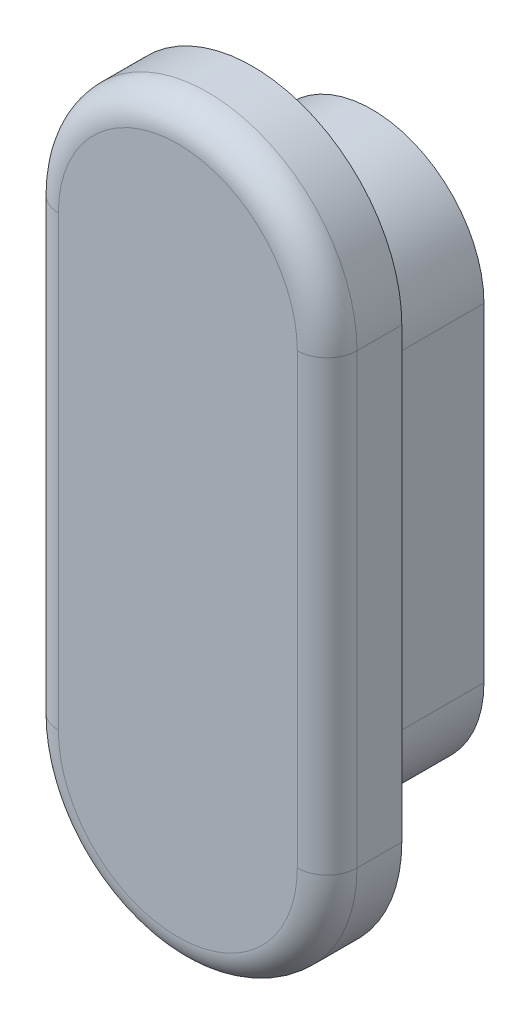
ISO-10303-21;
HEADER;
FILE_DESCRIPTION(('STEP AP214'),'2;1');
FILE_NAME('part.step','',(''),(''),'','','');
FILE_SCHEMA(('AUTOMOTIVE_DESIGN { 1 0 10303 214 1 1 1 1 }'));
ENDSEC;
DATA;
#1=APPLICATION_CONTEXT('core data for automotive mechanical design processes');
#2=APPLICATION_PROTOCOL_DEFINITION('international standard','automotive_design',2000,#1);
#3=PRODUCT_CONTEXT('',#1,'mechanical');
#4=PRODUCT('Part','Part','',(#3));
#5=PRODUCT_RELATED_PRODUCT_CATEGORY('part','',(#4));
#6=PRODUCT_DEFINITION_FORMATION('','',#4);
#7=PRODUCT_DEFINITION_CONTEXT('part definition',#1,'design');
#8=PRODUCT_DEFINITION('design','',#6,#7);
#9=PRODUCT_DEFINITION_SHAPE('','',#8);
#10=(LENGTH_UNIT() NAMED_UNIT(*) SI_UNIT(.MILLI.,.METRE.));
#11=(NAMED_UNIT(*) PLANE_ANGLE_UNIT() SI_UNIT($,.RADIAN.));
#12=(NAMED_UNIT(*) SI_UNIT($,.STERADIAN.) SOLID_ANGLE_UNIT());
#13=UNCERTAINTY_MEASURE_WITH_UNIT(LENGTH_MEASURE(1.E-05),#10,'distance_accuracy_value','');
#14=(GEOMETRIC_REPRESENTATION_CONTEXT(3) GLOBAL_UNCERTAINTY_ASSIGNED_CONTEXT((#13)) GLOBAL_UNIT_ASSIGNED_CONTEXT((#10,
#11,#12)) REPRESENTATION_CONTEXT('',''));
#15=CARTESIAN_POINT('',(0.,0.,0.));
#16=DIRECTION('',(0.,0.,1.));
#17=DIRECTION('',(1.,0.,0.));
#18=AXIS2_PLACEMENT_3D('',#15,#16,#17);
#19=CARTESIAN_POINT('',(0.,-11.,0.));
#20=DIRECTION('',(0.,0.,1.));
#21=DIRECTION('',(1.,0.,0.));
#22=AXIS2_PLACEMENT_3D('',#19,#20,#21);
#23=PLANE('',#22);
#24=CARTESIAN_POINT('',(0.,-11.,0.));
#25=DIRECTION('',(0.,0.,1.));
#26=DIRECTION('',(1.,0.,0.));
#27=AXIS2_PLACEMENT_3D('',#24,#25,#26);
#28=CIRCLE('',#27,7.5);
#29=CARTESIAN_POINT('',(-7.5,-11.,0.));
#30=VERTEX_POINT('',#29);
#31=CARTESIAN_POINT('',(7.5,-11.,0.));
#32=VERTEX_POINT('',#31);
#33=EDGE_CURVE('E164',#30,#32,#28,.T.);
#34=ORIENTED_EDGE('',*,*,#33,.F.);
#35=DIRECTION('',(0.,-1.,0.));
#36=VECTOR('',#35,1.);
#37=CARTESIAN_POINT('',(-7.5,-11.,0.));
#38=LINE('',#37,#36);
#39=CARTESIAN_POINT('',(-7.5,11.,0.));
#40=VERTEX_POINT('',#39);
#41=EDGE_CURVE('E169',#40,#30,#38,.T.);
#42=ORIENTED_EDGE('',*,*,#41,.F.);
#43=CARTESIAN_POINT('',(0.,11.,0.));
#44=DIRECTION('',(0.,0.,1.));
#45=DIRECTION('',(1.,0.,0.));
#46=AXIS2_PLACEMENT_3D('',#43,#44,#45);
#47=CIRCLE('',#46,7.5);
#48=CARTESIAN_POINT('',(7.5,11.,0.));
#49=VERTEX_POINT('',#48);
#50=EDGE_CURVE('E183',#49,#40,#47,.T.);
#51=ORIENTED_EDGE('',*,*,#50,.F.);
#52=DIRECTION('',(0.,1.,0.));
#53=VECTOR('',#52,1.);
#54=CARTESIAN_POINT('',(7.5,-11.,0.));
#55=LINE('',#54,#53);
#56=EDGE_CURVE('E181',#32,#49,#55,.T.);
#57=ORIENTED_EDGE('',*,*,#56,.F.);
#58=EDGE_LOOP('',(#34,#42,#51,#57));
#59=FACE_BOUND('',#58,.T.);
#60=CARTESIAN_POINT('',(0.,-11.,0.));
#61=DIRECTION('',(0.,0.,1.));
#62=DIRECTION('',(1.,0.,0.));
#63=AXIS2_PLACEMENT_3D('',#60,#61,#62);
#64=CIRCLE('',#63,2.);
#65=CARTESIAN_POINT('',(2.,-11.,0.));
#66=VERTEX_POINT('',#65);
#67=EDGE_CURVE('E159',#66,#66,#64,.T.);
#68=ORIENTED_EDGE('',*,*,#67,.T.);
#69=EDGE_LOOP('',(#68));
#70=FACE_BOUND('',#69,.T.);
#71=CARTESIAN_POINT('',(0.,11.,0.));
#72=DIRECTION('',(0.,0.,1.));
#73=DIRECTION('',(1.,0.,0.));
#74=AXIS2_PLACEMENT_3D('',#71,#72,#73);
#75=CIRCLE('',#74,2.);
#76=CARTESIAN_POINT('',(2.,11.,0.));
#77=VERTEX_POINT('',#76);
#78=EDGE_CURVE('E156',#77,#77,#75,.T.);
#79=ORIENTED_EDGE('',*,*,#78,.T.);
#80=EDGE_LOOP('',(#79));
#81=FACE_BOUND('',#80,.T.);
#82=ADVANCED_FACE('F41',(#59,#70,#81),#23,.F.);
#83=CARTESIAN_POINT('',(0.,-11.,8.));
#84=DIRECTION('',(0.,0.,-1.));
#85=DIRECTION('',(-1.,0.,0.));
#86=AXIS2_PLACEMENT_3D('',#83,#84,#85);
#87=CYLINDRICAL_SURFACE('',#86,7.5);
#88=ORIENTED_EDGE('',*,*,#33,.T.);
#89=DIRECTION('',(0.,0.,-1.));
#90=VECTOR('',#89,1.);
#91=CARTESIAN_POINT('',(7.5,-11.,8.));
#92=LINE('',#91,#90);
#93=CARTESIAN_POINT('',(7.5,-11.,8.));
#94=VERTEX_POINT('',#93);
#95=EDGE_CURVE('E194',#94,#32,#92,.T.);
#96=ORIENTED_EDGE('',*,*,#95,.F.);
#97=CARTESIAN_POINT('',(0.,-11.,8.));
#98=DIRECTION('',(0.,0.,1.));
#99=DIRECTION('',(1.,0.,0.));
#100=AXIS2_PLACEMENT_3D('',#97,#98,#99);
#101=CIRCLE('',#100,7.5);
#102=CARTESIAN_POINT('',(-7.5,-11.,8.));
#103=VERTEX_POINT('',#102);
#104=EDGE_CURVE('E165',#103,#94,#101,.T.);
#105=ORIENTED_EDGE('',*,*,#104,.F.);
#106=DIRECTION('',(0.,0.,-1.));
#107=VECTOR('',#106,1.);
#108=CARTESIAN_POINT('',(-7.5,-11.,8.));
#109=LINE('',#108,#107);
#110=EDGE_CURVE('E178',#103,#30,#109,.T.);
#111=ORIENTED_EDGE('',*,*,#110,.T.);
#112=EDGE_LOOP('',(#88,#96,#105,#111));
#113=FACE_BOUND('',#112,.T.);
#114=ADVANCED_FACE('F239',(#113),#87,.T.);
#115=CARTESIAN_POINT('',(7.5,-11.,8.));
#116=DIRECTION('',(-1.,0.,0.));
#117=DIRECTION('',(0.,-1.,0.));
#118=AXIS2_PLACEMENT_3D('',#115,#116,#117);
#119=PLANE('',#118);
#120=ORIENTED_EDGE('',*,*,#56,.T.);
#121=DIRECTION('',(0.,0.,-1.));
#122=VECTOR('',#121,1.);
#123=CARTESIAN_POINT('',(7.5,11.,8.));
#124=LINE('',#123,#122);
#125=CARTESIAN_POINT('',(7.5,11.,8.));
#126=VERTEX_POINT('',#125);
#127=EDGE_CURVE('E191',#126,#49,#124,.T.);
#128=ORIENTED_EDGE('',*,*,#127,.F.);
#129=DIRECTION('',(0.,1.,0.));
#130=VECTOR('',#129,1.);
#131=CARTESIAN_POINT('',(7.5,-11.,8.));
#132=LINE('',#131,#130);
#133=EDGE_CURVE('E168',#94,#126,#132,.T.);
#134=ORIENTED_EDGE('',*,*,#133,.F.);
#135=ORIENTED_EDGE('',*,*,#95,.T.);
#136=EDGE_LOOP('',(#120,#128,#134,#135));
#137=FACE_BOUND('',#136,.T.);
#138=ADVANCED_FACE('F246',(#137),#119,.F.);
#139=CARTESIAN_POINT('',(0.,11.,8.));
#140=DIRECTION('',(0.,0.,-1.));
#141=DIRECTION('',(-1.,0.,0.));
#142=AXIS2_PLACEMENT_3D('',#139,#140,#141);
#143=CYLINDRICAL_SURFACE('',#142,7.5);
#144=ORIENTED_EDGE('',*,*,#50,.T.);
#145=DIRECTION('',(0.,0.,-1.));
#146=VECTOR('',#145,1.);
#147=CARTESIAN_POINT('',(-7.5,11.,8.));
#148=LINE('',#147,#146);
#149=CARTESIAN_POINT('',(-7.5,11.,8.));
#150=VERTEX_POINT('',#149);
#151=EDGE_CURVE('E188',#150,#40,#148,.T.);
#152=ORIENTED_EDGE('',*,*,#151,.F.);
#153=CARTESIAN_POINT('',(0.,11.,8.));
#154=DIRECTION('',(0.,0.,1.));
#155=DIRECTION('',(1.,0.,0.));
#156=AXIS2_PLACEMENT_3D('',#153,#154,#155);
#157=CIRCLE('',#156,7.5);
#158=EDGE_CURVE('E172',#126,#150,#157,.T.);
#159=ORIENTED_EDGE('',*,*,#158,.F.);
#160=ORIENTED_EDGE('',*,*,#127,.T.);
#161=EDGE_LOOP('',(#144,#152,#159,#160));
#162=FACE_BOUND('',#161,.T.);
#163=ADVANCED_FACE('F258',(#162),#143,.T.);
#164=CARTESIAN_POINT('',(-7.5,-11.,8.));
#165=DIRECTION('',(1.,0.,0.));
#166=DIRECTION('',(0.,1.,0.));
#167=AXIS2_PLACEMENT_3D('',#164,#165,#166);
#168=PLANE('',#167);
#169=ORIENTED_EDGE('',*,*,#41,.T.);
#170=ORIENTED_EDGE('',*,*,#110,.F.);
#171=DIRECTION('',(0.,-1.,0.));
#172=VECTOR('',#171,1.);
#173=CARTESIAN_POINT('',(-7.5,-11.,8.));
#174=LINE('',#173,#172);
#175=EDGE_CURVE('E175',#150,#103,#174,.T.);
#176=ORIENTED_EDGE('',*,*,#175,.F.);
#177=ORIENTED_EDGE('',*,*,#151,.T.);
#178=EDGE_LOOP('',(#169,#170,#176,#177));
#179=FACE_BOUND('',#178,.T.);
#180=ADVANCED_FACE('F255',(#179),#168,.F.);
#181=CARTESIAN_POINT('',(0.,-11.,8.));
#182=DIRECTION('',(0.,0.,-1.));
#183=DIRECTION('',(-1.,0.,0.));
#184=AXIS2_PLACEMENT_3D('',#181,#182,#183);
#185=CYLINDRICAL_SURFACE('',#184,2.);
#186=CARTESIAN_POINT('',(0.,-11.,8.));
#187=DIRECTION('',(0.,0.,1.));
#188=DIRECTION('',(1.,0.,0.));
#189=AXIS2_PLACEMENT_3D('',#186,#187,#188);
#190=CIRCLE('',#189,2.);
#191=CARTESIAN_POINT('',(2.,-11.,8.));
#192=VERTEX_POINT('',#191);
#193=EDGE_CURVE('E155',#192,#192,#190,.T.);
#194=ORIENTED_EDGE('',*,*,#193,.T.);
#195=EDGE_LOOP('',(#194));
#196=FACE_BOUND('',#195,.T.);
#197=ORIENTED_EDGE('',*,*,#67,.F.);
#198=EDGE_LOOP('',(#197));
#199=FACE_BOUND('',#198,.T.);
#200=ADVANCED_FACE('F253',(#196,#199),#185,.F.);
#201=CARTESIAN_POINT('',(0.,11.,8.));
#202=DIRECTION('',(0.,0.,-1.));
#203=DIRECTION('',(-1.,0.,0.));
#204=AXIS2_PLACEMENT_3D('',#201,#202,#203);
#205=CYLINDRICAL_SURFACE('',#204,2.);
#206=CARTESIAN_POINT('',(0.,11.,8.));
#207=DIRECTION('',(0.,0.,1.));
#208=DIRECTION('',(1.,0.,0.));
#209=AXIS2_PLACEMENT_3D('',#206,#207,#208);
#210=CIRCLE('',#209,2.);
#211=CARTESIAN_POINT('',(2.,11.,8.));
#212=VERTEX_POINT('',#211);
#213=EDGE_CURVE('E128',#212,#212,#210,.T.);
#214=ORIENTED_EDGE('',*,*,#213,.T.);
#215=EDGE_LOOP('',(#214));
#216=FACE_BOUND('',#215,.T.);
#217=ORIENTED_EDGE('',*,*,#78,.F.);
#218=EDGE_LOOP('',(#217));
#219=FACE_BOUND('',#218,.T.);
#220=ADVANCED_FACE('F355',(#216,#219),#205,.F.);
#221=CARTESIAN_POINT('',(0.,-15.,8.));
#222=DIRECTION('',(0.,0.,1.));
#223=DIRECTION('',(1.,0.,0.));
#224=AXIS2_PLACEMENT_3D('',#221,#222,#223);
#225=PLANE('',#224);
#226=ORIENTED_EDGE('',*,*,#213,.F.);
#227=EDGE_LOOP('',(#226));
#228=FACE_BOUND('',#227,.T.);
#229=ADVANCED_FACE('F297',(#228),#225,.F.);
#230=ORIENTED_EDGE('',*,*,#175,.T.);
#231=ORIENTED_EDGE('',*,*,#104,.T.);
#232=ORIENTED_EDGE('',*,*,#133,.T.);
#233=ORIENTED_EDGE('',*,*,#158,.T.);
#234=EDGE_LOOP('',(#230,#231,#232,#233));
#235=FACE_BOUND('',#234,.T.);
#236=CARTESIAN_POINT('',(0.,-15.,8.));
#237=DIRECTION('',(0.,0.,1.));
#238=DIRECTION('',(1.,0.,0.));
#239=AXIS2_PLACEMENT_3D('',#236,#237,#238);
#240=CIRCLE('',#239,10.);
#241=CARTESIAN_POINT('',(-10.,-15.,8.));
#242=VERTEX_POINT('',#241);
#243=CARTESIAN_POINT('',(10.,-15.,8.));
#244=VERTEX_POINT('',#243);
#245=EDGE_CURVE('E135',#242,#244,#240,.T.);
#246=ORIENTED_EDGE('',*,*,#245,.F.);
#247=DIRECTION('',(0.,-1.,0.));
#248=VECTOR('',#247,1.);
#249=CARTESIAN_POINT('',(-10.,-15.,8.));
#250=LINE('',#249,#248);
#251=CARTESIAN_POINT('',(-10.,15.,8.));
#252=VERTEX_POINT('',#251);
#253=EDGE_CURVE('E147',#252,#242,#250,.T.);
#254=ORIENTED_EDGE('',*,*,#253,.F.);
#255=CARTESIAN_POINT('',(0.,15.,8.));
#256=DIRECTION('',(0.,0.,1.));
#257=DIRECTION('',(1.,0.,0.));
#258=AXIS2_PLACEMENT_3D('',#255,#256,#257);
#259=CIRCLE('',#258,10.);
#260=CARTESIAN_POINT('',(9.99999999999999,15.,8.));
#261=VERTEX_POINT('',#260);
#262=EDGE_CURVE('E137',#261,#252,#259,.T.);
#263=ORIENTED_EDGE('',*,*,#262,.F.);
#264=DIRECTION('',(0.,1.,0.));
#265=VECTOR('',#264,1.);
#266=CARTESIAN_POINT('',(10.,-15.,8.));
#267=LINE('',#266,#265);
#268=EDGE_CURVE('E123',#244,#261,#267,.T.);
#269=ORIENTED_EDGE('',*,*,#268,.F.);
#270=EDGE_LOOP('',(#246,#254,#263,#269));
#271=FACE_BOUND('',#270,.T.);
#272=ADVANCED_FACE('F133',(#235,#271),#225,.F.);
#273=CARTESIAN_POINT('',(0.,-15.,13.));
#274=DIRECTION('',(0.,0.,1.));
#275=DIRECTION('',(1.,0.,0.));
#276=AXIS2_PLACEMENT_3D('',#273,#274,#275);
#277=PLANE('',#276);
#278=CARTESIAN_POINT('',(0.,-15.,13.));
#279=DIRECTION('',(0.,0.,1.));
#280=DIRECTION('',(1.,0.,0.));
#281=AXIS2_PLACEMENT_3D('',#278,#279,#280);
#282=CIRCLE('',#281,8.);
#283=CARTESIAN_POINT('',(-8.,-15.,13.));
#284=VERTEX_POINT('',#283);
#285=CARTESIAN_POINT('',(8.,-15.,13.));
#286=VERTEX_POINT('',#285);
#287=EDGE_CURVE('E201',#284,#286,#282,.T.);
#288=ORIENTED_EDGE('',*,*,#287,.T.);
#289=DIRECTION('',(0.,1.,0.));
#290=VECTOR('',#289,1.);
#291=CARTESIAN_POINT('',(7.99999999999999,15.,13.));
#292=LINE('',#291,#290);
#293=CARTESIAN_POINT('',(7.99999999999999,15.,13.));
#294=VERTEX_POINT('',#293);
#295=EDGE_CURVE('E203',#286,#294,#292,.T.);
#296=ORIENTED_EDGE('',*,*,#295,.T.);
#297=CARTESIAN_POINT('',(0.,15.,13.));
#298=DIRECTION('',(0.,0.,1.));
#299=DIRECTION('',(1.,0.,0.));
#300=AXIS2_PLACEMENT_3D('',#297,#298,#299);
#301=CIRCLE('',#300,8.);
#302=CARTESIAN_POINT('',(-8.00000000000001,15.,13.));
#303=VERTEX_POINT('',#302);
#304=EDGE_CURVE('E197',#294,#303,#301,.T.);
#305=ORIENTED_EDGE('',*,*,#304,.T.);
#306=DIRECTION('',(0.,-1.,0.));
#307=VECTOR('',#306,1.);
#308=CARTESIAN_POINT('',(-8.,-15.,13.));
#309=LINE('',#308,#307);
#310=EDGE_CURVE('E199',#303,#284,#309,.T.);
#311=ORIENTED_EDGE('',*,*,#310,.T.);
#312=EDGE_LOOP('',(#288,#296,#305,#311));
#313=FACE_BOUND('',#312,.T.);
#314=ADVANCED_FACE('F224',(#313),#277,.T.);
#315=CARTESIAN_POINT('',(-10.,-15.,13.));
#316=DIRECTION('',(1.,0.,0.));
#317=DIRECTION('',(0.,1.,0.));
#318=AXIS2_PLACEMENT_3D('',#315,#316,#317);
#319=PLANE('',#318);
#320=DIRECTION('',(0.,0.,-1.));
#321=VECTOR('',#320,1.);
#322=CARTESIAN_POINT('',(-10.,-15.,13.));
#323=LINE('',#322,#321);
#324=CARTESIAN_POINT('',(-10.,-15.,11.));
#325=VERTEX_POINT('',#324);
#326=EDGE_CURVE('E140',#325,#242,#323,.T.);
#327=ORIENTED_EDGE('',*,*,#326,.F.);
#328=DIRECTION('',(0.,-1.,0.));
#329=VECTOR('',#328,1.);
#330=CARTESIAN_POINT('',(-10.,15.,11.));
#331=LINE('',#330,#329);
#332=CARTESIAN_POINT('',(-10.,15.,11.));
#333=VERTEX_POINT('',#332);
#334=EDGE_CURVE('E50',#325,#333,#331,.F.);
#335=ORIENTED_EDGE('',*,*,#334,.T.);
#336=DIRECTION('',(0.,0.,-1.));
#337=VECTOR('',#336,1.);
#338=CARTESIAN_POINT('',(-10.,15.,13.));
#339=LINE('',#338,#337);
#340=EDGE_CURVE('E150',#333,#252,#339,.T.);
#341=ORIENTED_EDGE('',*,*,#340,.T.);
#342=ORIENTED_EDGE('',*,*,#253,.T.);
#343=EDGE_LOOP('',(#327,#335,#341,#342));
#344=FACE_BOUND('',#343,.T.);
#345=ADVANCED_FACE('F323',(#344),#319,.F.);
#346=CARTESIAN_POINT('',(0.,15.,13.));
#347=DIRECTION('',(0.,0.,-1.));
#348=DIRECTION('',(-1.,0.,0.));
#349=AXIS2_PLACEMENT_3D('',#346,#347,#348);
#350=CYLINDRICAL_SURFACE('',#349,10.);
#351=ORIENTED_EDGE('',*,*,#340,.F.);
#352=CARTESIAN_POINT('',(0.,15.,11.));
#353=DIRECTION('',(0.,0.,1.));
#354=DIRECTION('',(1.,0.,0.));
#355=AXIS2_PLACEMENT_3D('',#352,#353,#354);
#356=CIRCLE('',#355,10.);
#357=CARTESIAN_POINT('',(9.99999999999999,15.,11.));
#358=VERTEX_POINT('',#357);
#359=EDGE_CURVE('E11',#333,#358,#356,.F.);
#360=ORIENTED_EDGE('',*,*,#359,.T.);
#361=DIRECTION('',(0.,0.,-1.));
#362=VECTOR('',#361,1.);
#363=CARTESIAN_POINT('',(9.99999999999999,15.,13.));
#364=LINE('',#363,#362);
#365=EDGE_CURVE('E129',#358,#261,#364,.T.);
#366=ORIENTED_EDGE('',*,*,#365,.T.);
#367=ORIENTED_EDGE('',*,*,#262,.T.);
#368=EDGE_LOOP('',(#351,#360,#366,#367));
#369=FACE_BOUND('',#368,.T.);
#370=ADVANCED_FACE('F314',(#369),#350,.T.);
#371=CARTESIAN_POINT('',(10.,-15.,13.));
#372=DIRECTION('',(-1.,0.,0.));
#373=DIRECTION('',(0.,-1.,0.));
#374=AXIS2_PLACEMENT_3D('',#371,#372,#373);
#375=PLANE('',#374);
#376=ORIENTED_EDGE('',*,*,#365,.F.);
#377=DIRECTION('',(0.,1.,0.));
#378=VECTOR('',#377,1.);
#379=CARTESIAN_POINT('',(10.,-15.,11.));
#380=LINE('',#379,#378);
#381=CARTESIAN_POINT('',(10.,-15.,11.));
#382=VERTEX_POINT('',#381);
#383=EDGE_CURVE('E126',#358,#382,#380,.F.);
#384=ORIENTED_EDGE('',*,*,#383,.T.);
#385=DIRECTION('',(0.,0.,-1.));
#386=VECTOR('',#385,1.);
#387=CARTESIAN_POINT('',(10.,-15.,13.));
#388=LINE('',#387,#386);
#389=EDGE_CURVE('E119',#382,#244,#388,.T.);
#390=ORIENTED_EDGE('',*,*,#389,.T.);
#391=ORIENTED_EDGE('',*,*,#268,.T.);
#392=EDGE_LOOP('',(#376,#384,#390,#391));
#393=FACE_BOUND('',#392,.T.);
#394=ADVANCED_FACE('F122',(#393),#375,.F.);
#395=CARTESIAN_POINT('',(0.,-15.,13.));
#396=DIRECTION('',(0.,0.,-1.));
#397=DIRECTION('',(-1.,0.,0.));
#398=AXIS2_PLACEMENT_3D('',#395,#396,#397);
#399=CYLINDRICAL_SURFACE('',#398,10.);
#400=ORIENTED_EDGE('',*,*,#389,.F.);
#401=CARTESIAN_POINT('',(0.,-15.,11.));
#402=DIRECTION('',(0.,0.,1.));
#403=DIRECTION('',(1.,0.,0.));
#404=AXIS2_PLACEMENT_3D('',#401,#402,#403);
#405=CIRCLE('',#404,10.);
#406=EDGE_CURVE('E65',#382,#325,#405,.F.);
#407=ORIENTED_EDGE('',*,*,#406,.T.);
#408=ORIENTED_EDGE('',*,*,#326,.T.);
#409=ORIENTED_EDGE('',*,*,#245,.T.);
#410=EDGE_LOOP('',(#400,#407,#408,#409));
#411=FACE_BOUND('',#410,.T.);
#412=ADVANCED_FACE('F139',(#411),#399,.T.);
#413=ORIENTED_EDGE('',*,*,#193,.F.);
#414=EDGE_LOOP('',(#413));
#415=FACE_BOUND('',#414,.T.);
#416=ADVANCED_FACE('F237',(#415),#225,.F.);
#417=CARTESIAN_POINT('',(-8.,-15.,11.));
#418=DIRECTION('',(0.,1.,0.));
#419=DIRECTION('',(-1.,0.,0.));
#420=AXIS2_PLACEMENT_3D('',#417,#418,#419);
#421=CYLINDRICAL_SURFACE('',#420,2.);
#422=CARTESIAN_POINT('',(-8.00000000000001,15.,11.));
#423=DIRECTION('',(0.,1.,0.));
#424=DIRECTION('',(0.,0.,1.));
#425=AXIS2_PLACEMENT_3D('',#422,#423,#424);
#426=CIRCLE('',#425,2.);
#427=EDGE_CURVE('E144',#333,#303,#426,.T.);
#428=ORIENTED_EDGE('',*,*,#427,.F.);
#429=ORIENTED_EDGE('',*,*,#334,.F.);
#430=CARTESIAN_POINT('',(-8.,-15.,11.));
#431=DIRECTION('',(0.,-1.,0.));
#432=DIRECTION('',(0.,0.,-1.));
#433=AXIS2_PLACEMENT_3D('',#430,#431,#432);
#434=CIRCLE('',#433,2.);
#435=EDGE_CURVE('E45',#284,#325,#434,.T.);
#436=ORIENTED_EDGE('',*,*,#435,.F.);
#437=ORIENTED_EDGE('',*,*,#310,.F.);
#438=EDGE_LOOP('',(#428,#429,#436,#437));
#439=FACE_BOUND('',#438,.T.);
#440=ADVANCED_FACE('F43',(#439),#421,.T.);
#441=CARTESIAN_POINT('',(0.,-15.,11.));
#442=DIRECTION('',(0.,0.,1.));
#443=DIRECTION('',(1.,0.,0.));
#444=AXIS2_PLACEMENT_3D('',#441,#442,#443);
#445=TOROIDAL_SURFACE('',#444,8.,2.);
#446=ORIENTED_EDGE('',*,*,#435,.T.);
#447=ORIENTED_EDGE('',*,*,#406,.F.);
#448=CARTESIAN_POINT('',(8.,-15.,11.));
#449=DIRECTION('',(0.,1.,0.));
#450=DIRECTION('',(0.,0.,1.));
#451=AXIS2_PLACEMENT_3D('',#448,#449,#450);
#452=CIRCLE('',#451,2.);
#453=EDGE_CURVE('E211',#286,#382,#452,.T.);
#454=ORIENTED_EDGE('',*,*,#453,.F.);
#455=ORIENTED_EDGE('',*,*,#287,.F.);
#456=EDGE_LOOP('',(#446,#447,#454,#455));
#457=FACE_BOUND('',#456,.T.);
#458=ADVANCED_FACE('F230',(#457),#445,.T.);
#459=CARTESIAN_POINT('',(0.,15.,11.));
#460=DIRECTION('',(0.,0.,1.));
#461=DIRECTION('',(1.,0.,0.));
#462=AXIS2_PLACEMENT_3D('',#459,#460,#461);
#463=TOROIDAL_SURFACE('',#462,8.,2.);
#464=ORIENTED_EDGE('',*,*,#427,.T.);
#465=ORIENTED_EDGE('',*,*,#304,.F.);
#466=CARTESIAN_POINT('',(7.99999999999999,15.,11.));
#467=DIRECTION('',(0.,-1.,0.));
#468=DIRECTION('',(0.,0.,-1.));
#469=AXIS2_PLACEMENT_3D('',#466,#467,#468);
#470=CIRCLE('',#469,2.);
#471=EDGE_CURVE('E209',#358,#294,#470,.T.);
#472=ORIENTED_EDGE('',*,*,#471,.F.);
#473=ORIENTED_EDGE('',*,*,#359,.F.);
#474=EDGE_LOOP('',(#464,#465,#472,#473));
#475=FACE_BOUND('',#474,.T.);
#476=ADVANCED_FACE('F217',(#475),#463,.T.);
#477=CARTESIAN_POINT('',(8.,-15.,11.));
#478=DIRECTION('',(0.,-1.,0.));
#479=DIRECTION('',(1.,0.,0.));
#480=AXIS2_PLACEMENT_3D('',#477,#478,#479);
#481=CYLINDRICAL_SURFACE('',#480,2.);
#482=ORIENTED_EDGE('',*,*,#453,.T.);
#483=ORIENTED_EDGE('',*,*,#383,.F.);
#484=ORIENTED_EDGE('',*,*,#471,.T.);
#485=ORIENTED_EDGE('',*,*,#295,.F.);
#486=EDGE_LOOP('',(#482,#483,#484,#485));
#487=FACE_BOUND('',#486,.T.);
#488=ADVANCED_FACE('F228',(#487),#481,.T.);
#489=CLOSED_SHELL('',(#82,#114,#138,#163,#180,#200,#220,#229,#272,#314,#345,#370,#394,#412,#416,
#440,#458,#476,#488));
#490=MANIFOLD_SOLID_BREP('B2',#489);
#491=ADVANCED_BREP_SHAPE_REPRESENTATION('',(#18,#490),#14);
#492=SHAPE_DEFINITION_REPRESENTATION(#9,#491);
ENDSEC;
END-ISO-10303-21;
